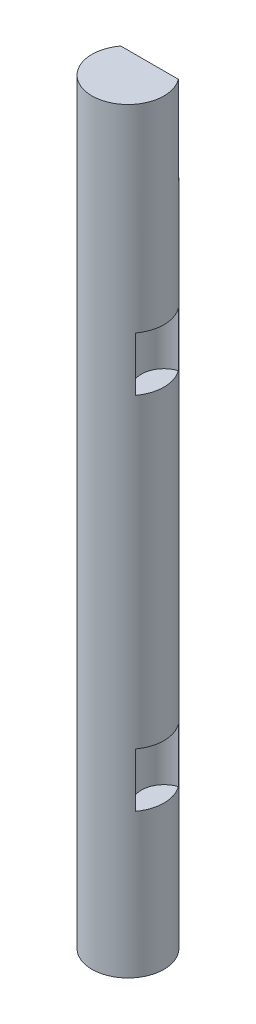
ISO-10303-21;
HEADER;
FILE_DESCRIPTION(('STEP AP214'),'2;1');
FILE_NAME('part.step','',(''),(''),'','','');
FILE_SCHEMA(('AUTOMOTIVE_DESIGN { 1 0 10303 214 1 1 1 1 }'));
ENDSEC;
DATA;
#1=APPLICATION_CONTEXT('core data for automotive mechanical design processes');
#2=APPLICATION_PROTOCOL_DEFINITION('international standard','automotive_design',2000,#1);
#3=PRODUCT_CONTEXT('',#1,'mechanical');
#4=PRODUCT('Part','Part','',(#3));
#5=PRODUCT_RELATED_PRODUCT_CATEGORY('part','',(#4));
#6=PRODUCT_DEFINITION_FORMATION('','',#4);
#7=PRODUCT_DEFINITION_CONTEXT('part definition',#1,'design');
#8=PRODUCT_DEFINITION('design','',#6,#7);
#9=PRODUCT_DEFINITION_SHAPE('','',#8);
#10=(LENGTH_UNIT() NAMED_UNIT(*) SI_UNIT(.MILLI.,.METRE.));
#11=(NAMED_UNIT(*) PLANE_ANGLE_UNIT() SI_UNIT($,.RADIAN.));
#12=(NAMED_UNIT(*) SI_UNIT($,.STERADIAN.) SOLID_ANGLE_UNIT());
#13=UNCERTAINTY_MEASURE_WITH_UNIT(LENGTH_MEASURE(1.E-05),#10,'distance_accuracy_value','');
#14=(GEOMETRIC_REPRESENTATION_CONTEXT(3) GLOBAL_UNCERTAINTY_ASSIGNED_CONTEXT((#13)) GLOBAL_UNIT_ASSIGNED_CONTEXT((#10,
#11,#12)) REPRESENTATION_CONTEXT('',''));
#15=CARTESIAN_POINT('',(0.,0.,0.));
#16=DIRECTION('',(0.,0.,1.));
#17=DIRECTION('',(1.,0.,0.));
#18=AXIS2_PLACEMENT_3D('',#15,#16,#17);
#19=CARTESIAN_POINT('',(0.,21.,0.));
#20=DIRECTION('',(0.,-1.,0.));
#21=DIRECTION('',(0.,0.,-1.));
#22=AXIS2_PLACEMENT_3D('',#19,#20,#21);
#23=CYLINDRICAL_SURFACE('',#22,2.);
#24=CARTESIAN_POINT('',(0.,7.,0.));
#25=DIRECTION('',(0.,1.,0.));
#26=DIRECTION('',(0.,0.,1.));
#27=AXIS2_PLACEMENT_3D('',#24,#25,#26);
#28=CIRCLE('',#27,2.);
#29=CARTESIAN_POINT('',(1.609375,7.,1.18739719949771));
#30=VERTEX_POINT('',#29);
#31=CARTESIAN_POINT('',(1.609375,7.,-1.18739719949771));
#32=VERTEX_POINT('',#31);
#33=EDGE_CURVE('E102',#30,#32,#28,.T.);
#34=ORIENTED_EDGE('',*,*,#33,.F.);
#35=DIRECTION('',(0.,1.,0.));
#36=VECTOR('',#35,1.);
#37=CARTESIAN_POINT('',(1.609375,8.5,1.18739719949771));
#38=LINE('',#37,#36);
#39=CARTESIAN_POINT('',(1.609375,10.,1.18739719949771));
#40=VERTEX_POINT('',#39);
#41=EDGE_CURVE('E118',#30,#40,#38,.T.);
#42=ORIENTED_EDGE('',*,*,#41,.T.);
#43=CARTESIAN_POINT('',(0.,10.,0.));
#44=DIRECTION('',(0.,1.,0.));
#45=DIRECTION('',(0.,0.,1.));
#46=AXIS2_PLACEMENT_3D('',#43,#44,#45);
#47=CIRCLE('',#46,2.);
#48=CARTESIAN_POINT('',(1.609375,10.,-1.18739719949771));
#49=VERTEX_POINT('',#48);
#50=EDGE_CURVE('E126',#40,#49,#47,.T.);
#51=ORIENTED_EDGE('',*,*,#50,.T.);
#52=DIRECTION('',(0.,1.,0.));
#53=VECTOR('',#52,1.);
#54=CARTESIAN_POINT('',(1.609375,8.5,-1.18739719949771));
#55=LINE('',#54,#53);
#56=EDGE_CURVE('E122',#49,#32,#55,.F.);
#57=ORIENTED_EDGE('',*,*,#56,.T.);
#58=EDGE_LOOP('',(#34,#42,#51,#57));
#59=FACE_BOUND('',#58,.T.);
#60=CARTESIAN_POINT('',(0.,21.,0.));
#61=DIRECTION('',(0.,1.,0.));
#62=DIRECTION('',(0.,0.,1.));
#63=AXIS2_PLACEMENT_3D('',#60,#61,#62);
#64=CIRCLE('',#63,2.);
#65=CARTESIAN_POINT('',(-1.6,21.,-1.2));
#66=VERTEX_POINT('',#65);
#67=CARTESIAN_POINT('',(1.6,21.,-1.2));
#68=VERTEX_POINT('',#67);
#69=EDGE_CURVE('E130',#66,#68,#64,.T.);
#70=ORIENTED_EDGE('',*,*,#69,.F.);
#71=DIRECTION('',(0.,-1.,0.));
#72=VECTOR('',#71,1.);
#73=CARTESIAN_POINT('',(-1.6,73.9740502510427,-1.2));
#74=LINE('',#73,#72);
#75=CARTESIAN_POINT('',(-1.6,16.,-1.2));
#76=VERTEX_POINT('',#75);
#77=EDGE_CURVE('E148',#66,#76,#74,.T.);
#78=ORIENTED_EDGE('',*,*,#77,.T.);
#79=CARTESIAN_POINT('',(0.,16.,0.));
#80=DIRECTION('',(0.,1.,0.));
#81=DIRECTION('',(0.,0.,1.));
#82=AXIS2_PLACEMENT_3D('',#79,#80,#81);
#83=CIRCLE('',#82,2.);
#84=CARTESIAN_POINT('',(1.6,16.,-1.2));
#85=VERTEX_POINT('',#84);
#86=EDGE_CURVE('E139',#85,#76,#83,.T.);
#87=ORIENTED_EDGE('',*,*,#86,.F.);
#88=DIRECTION('',(0.,-1.,0.));
#89=VECTOR('',#88,1.);
#90=CARTESIAN_POINT('',(1.6,73.9740502510427,-1.2));
#91=LINE('',#90,#89);
#92=EDGE_CURVE('E151',#68,#85,#91,.T.);
#93=ORIENTED_EDGE('',*,*,#92,.F.);
#94=EDGE_LOOP('',(#70,#78,#87,#93));
#95=FACE_BOUND('',#94,.T.);
#96=CARTESIAN_POINT('',(0.,-21.,0.));
#97=DIRECTION('',(0.,1.,0.));
#98=DIRECTION('',(0.,0.,1.));
#99=AXIS2_PLACEMENT_3D('',#96,#97,#98);
#100=CIRCLE('',#99,2.);
#101=CARTESIAN_POINT('',(0.,-21.,2.));
#102=VERTEX_POINT('',#101);
#103=EDGE_CURVE('E131',#102,#102,#100,.T.);
#104=ORIENTED_EDGE('',*,*,#103,.T.);
#105=EDGE_LOOP('',(#104));
#106=FACE_BOUND('',#105,.T.);
#107=CARTESIAN_POINT('',(0.,-13.,0.));
#108=DIRECTION('',(0.,1.,0.));
#109=DIRECTION('',(0.,0.,1.));
#110=AXIS2_PLACEMENT_3D('',#107,#108,#109);
#111=CIRCLE('',#110,2.);
#112=CARTESIAN_POINT('',(1.609375,-13.,1.18739719949771));
#113=VERTEX_POINT('',#112);
#114=CARTESIAN_POINT('',(1.609375,-13.,-1.18739719949771));
#115=VERTEX_POINT('',#114);
#116=EDGE_CURVE('E11',#113,#115,#111,.T.);
#117=ORIENTED_EDGE('',*,*,#116,.F.);
#118=DIRECTION('',(0.,1.,0.));
#119=VECTOR('',#118,1.);
#120=CARTESIAN_POINT('',(1.609375,-11.5,1.18739719949771));
#121=LINE('',#120,#119);
#122=CARTESIAN_POINT('',(1.609375,-10.,1.18739719949771));
#123=VERTEX_POINT('',#122);
#124=EDGE_CURVE('E53',#113,#123,#121,.T.);
#125=ORIENTED_EDGE('',*,*,#124,.T.);
#126=CARTESIAN_POINT('',(0.,-10.,0.));
#127=DIRECTION('',(0.,1.,0.));
#128=DIRECTION('',(0.,0.,1.));
#129=AXIS2_PLACEMENT_3D('',#126,#127,#128);
#130=CIRCLE('',#129,2.);
#131=CARTESIAN_POINT('',(1.609375,-10.,-1.18739719949771));
#132=VERTEX_POINT('',#131);
#133=EDGE_CURVE('E95',#123,#132,#130,.T.);
#134=ORIENTED_EDGE('',*,*,#133,.T.);
#135=DIRECTION('',(0.,1.,0.));
#136=VECTOR('',#135,1.);
#137=CARTESIAN_POINT('',(1.609375,-11.5,-1.18739719949771));
#138=LINE('',#137,#136);
#139=EDGE_CURVE('E101',#132,#115,#138,.F.);
#140=ORIENTED_EDGE('',*,*,#139,.T.);
#141=EDGE_LOOP('',(#117,#125,#134,#140));
#142=FACE_BOUND('',#141,.T.);
#143=ADVANCED_FACE('F45',(#59,#95,#106,#142),#23,.T.);
#144=CARTESIAN_POINT('',(0.,21.,0.));
#145=DIRECTION('',(0.,1.,0.));
#146=DIRECTION('',(0.,0.,1.));
#147=AXIS2_PLACEMENT_3D('',#144,#145,#146);
#148=PLANE('',#147);
#149=DIRECTION('',(1.,0.,0.));
#150=VECTOR('',#149,1.);
#151=CARTESIAN_POINT('',(-1.6,21.,-1.2));
#152=LINE('',#151,#150);
#153=EDGE_CURVE('E135',#66,#68,#152,.T.);
#154=ORIENTED_EDGE('',*,*,#153,.F.);
#155=ORIENTED_EDGE('',*,*,#69,.T.);
#156=EDGE_LOOP('',(#154,#155));
#157=FACE_BOUND('',#156,.T.);
#158=ADVANCED_FACE('F176',(#157),#148,.T.);
#159=CARTESIAN_POINT('',(0.,-21.,0.));
#160=DIRECTION('',(0.,1.,0.));
#161=DIRECTION('',(0.,0.,1.));
#162=AXIS2_PLACEMENT_3D('',#159,#160,#161);
#163=PLANE('',#162);
#164=ORIENTED_EDGE('',*,*,#103,.F.);
#165=EDGE_LOOP('',(#164));
#166=FACE_BOUND('',#165,.T.);
#167=ADVANCED_FACE('F182',(#166),#163,.F.);
#168=CARTESIAN_POINT('',(-1.6,73.9740502510427,-1.2));
#169=DIRECTION('',(0.,0.,-1.));
#170=DIRECTION('',(-1.,0.,0.));
#171=AXIS2_PLACEMENT_3D('',#168,#169,#170);
#172=PLANE('',#171);
#173=ORIENTED_EDGE('',*,*,#77,.F.);
#174=ORIENTED_EDGE('',*,*,#153,.T.);
#175=ORIENTED_EDGE('',*,*,#92,.T.);
#176=DIRECTION('',(1.,0.,0.));
#177=VECTOR('',#176,1.);
#178=CARTESIAN_POINT('',(-1.6,16.,-1.2));
#179=LINE('',#178,#177);
#180=EDGE_CURVE('E143',#76,#85,#179,.T.);
#181=ORIENTED_EDGE('',*,*,#180,.F.);
#182=EDGE_LOOP('',(#173,#174,#175,#181));
#183=FACE_BOUND('',#182,.T.);
#184=ADVANCED_FACE('F193',(#183),#172,.T.);
#185=CARTESIAN_POINT('',(0.,16.,0.));
#186=DIRECTION('',(0.,1.,0.));
#187=DIRECTION('',(0.,0.,1.));
#188=AXIS2_PLACEMENT_3D('',#185,#186,#187);
#189=PLANE('',#188);
#190=ORIENTED_EDGE('',*,*,#180,.T.);
#191=ORIENTED_EDGE('',*,*,#86,.T.);
#192=EDGE_LOOP('',(#190,#191));
#193=FACE_BOUND('',#192,.T.);
#194=ADVANCED_FACE('F197',(#193),#189,.T.);
#195=CARTESIAN_POINT('',(2.,7.,0.));
#196=DIRECTION('',(0.,1.,0.));
#197=DIRECTION('',(0.,0.,1.));
#198=AXIS2_PLACEMENT_3D('',#195,#196,#197);
#199=CYLINDRICAL_SURFACE('',#198,1.25);
#200=CARTESIAN_POINT('',(2.,7.,0.));
#201=DIRECTION('',(0.,1.,0.));
#202=DIRECTION('',(0.,0.,1.));
#203=AXIS2_PLACEMENT_3D('',#200,#201,#202);
#204=CIRCLE('',#203,1.25);
#205=EDGE_CURVE('E144',#32,#30,#204,.T.);
#206=ORIENTED_EDGE('',*,*,#205,.F.);
#207=ORIENTED_EDGE('',*,*,#56,.F.);
#208=CARTESIAN_POINT('',(2.,10.,0.));
#209=DIRECTION('',(0.,1.,0.));
#210=DIRECTION('',(0.,0.,1.));
#211=AXIS2_PLACEMENT_3D('',#208,#209,#210);
#212=CIRCLE('',#211,1.25);
#213=EDGE_CURVE('E66',#49,#40,#212,.T.);
#214=ORIENTED_EDGE('',*,*,#213,.T.);
#215=ORIENTED_EDGE('',*,*,#41,.F.);
#216=EDGE_LOOP('',(#206,#207,#214,#215));
#217=FACE_BOUND('',#216,.T.);
#218=ADVANCED_FACE('F202',(#217),#199,.F.);
#219=CARTESIAN_POINT('',(0.,7.,0.));
#220=DIRECTION('',(0.,1.,0.));
#221=DIRECTION('',(0.,0.,1.));
#222=AXIS2_PLACEMENT_3D('',#219,#220,#221);
#223=PLANE('',#222);
#224=ORIENTED_EDGE('',*,*,#33,.T.);
#225=ORIENTED_EDGE('',*,*,#205,.T.);
#226=EDGE_LOOP('',(#224,#225));
#227=FACE_BOUND('',#226,.T.);
#228=ADVANCED_FACE('F207',(#227),#223,.T.);
#229=CARTESIAN_POINT('',(0.,10.,0.));
#230=DIRECTION('',(0.,1.,0.));
#231=DIRECTION('',(0.,0.,1.));
#232=AXIS2_PLACEMENT_3D('',#229,#230,#231);
#233=PLANE('',#232);
#234=ORIENTED_EDGE('',*,*,#213,.F.);
#235=ORIENTED_EDGE('',*,*,#50,.F.);
#236=EDGE_LOOP('',(#234,#235));
#237=FACE_BOUND('',#236,.T.);
#238=ADVANCED_FACE('F173',(#237),#233,.F.);
#239=CARTESIAN_POINT('',(2.,-13.,0.));
#240=DIRECTION('',(0.,1.,0.));
#241=DIRECTION('',(0.,0.,1.));
#242=AXIS2_PLACEMENT_3D('',#239,#240,#241);
#243=CYLINDRICAL_SURFACE('',#242,1.25);
#244=CARTESIAN_POINT('',(2.,-13.,0.));
#245=DIRECTION('',(0.,1.,0.));
#246=DIRECTION('',(0.,0.,1.));
#247=AXIS2_PLACEMENT_3D('',#244,#245,#246);
#248=CIRCLE('',#247,1.25);
#249=EDGE_CURVE('E109',#115,#113,#248,.T.);
#250=ORIENTED_EDGE('',*,*,#249,.F.);
#251=ORIENTED_EDGE('',*,*,#139,.F.);
#252=CARTESIAN_POINT('',(2.,-10.,0.));
#253=DIRECTION('',(0.,1.,0.));
#254=DIRECTION('',(0.,0.,1.));
#255=AXIS2_PLACEMENT_3D('',#252,#253,#254);
#256=CIRCLE('',#255,1.25);
#257=EDGE_CURVE('E59',#132,#123,#256,.T.);
#258=ORIENTED_EDGE('',*,*,#257,.T.);
#259=ORIENTED_EDGE('',*,*,#124,.F.);
#260=EDGE_LOOP('',(#250,#251,#258,#259));
#261=FACE_BOUND('',#260,.T.);
#262=ADVANCED_FACE('F106',(#261),#243,.F.);
#263=CARTESIAN_POINT('',(0.,-13.,0.));
#264=DIRECTION('',(0.,1.,0.));
#265=DIRECTION('',(0.,0.,1.));
#266=AXIS2_PLACEMENT_3D('',#263,#264,#265);
#267=PLANE('',#266);
#268=ORIENTED_EDGE('',*,*,#116,.T.);
#269=ORIENTED_EDGE('',*,*,#249,.T.);
#270=EDGE_LOOP('',(#268,#269));
#271=FACE_BOUND('',#270,.T.);
#272=ADVANCED_FACE('F165',(#271),#267,.T.);
#273=CARTESIAN_POINT('',(0.,-10.,0.));
#274=DIRECTION('',(0.,1.,0.));
#275=DIRECTION('',(0.,0.,1.));
#276=AXIS2_PLACEMENT_3D('',#273,#274,#275);
#277=PLANE('',#276);
#278=ORIENTED_EDGE('',*,*,#257,.F.);
#279=ORIENTED_EDGE('',*,*,#133,.F.);
#280=EDGE_LOOP('',(#278,#279));
#281=FACE_BOUND('',#280,.T.);
#282=ADVANCED_FACE('F96',(#281),#277,.F.);
#283=CLOSED_SHELL('',(#143,#158,#167,#184,#194,#218,#228,#238,#262,#272,#282));
#284=MANIFOLD_SOLID_BREP('B2',#283);
#285=ADVANCED_BREP_SHAPE_REPRESENTATION('',(#18,#284),#14);
#286=SHAPE_DEFINITION_REPRESENTATION(#9,#285);
ENDSEC;
END-ISO-10303-21;
